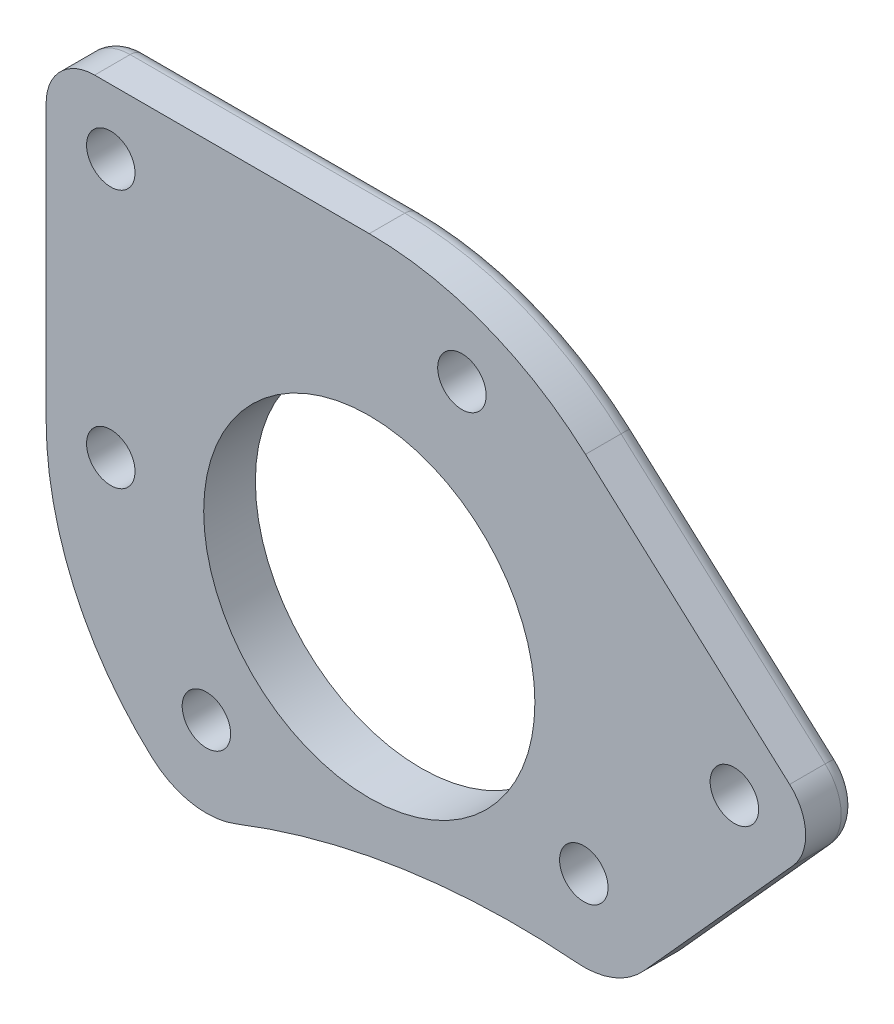
ISO-10303-21;
HEADER;
FILE_DESCRIPTION(('STEP AP214'),'2;1');
FILE_NAME('part.step','',(''),(''),'','','');
FILE_SCHEMA(('AUTOMOTIVE_DESIGN { 1 0 10303 214 1 1 1 1 }'));
ENDSEC;
DATA;
#1=APPLICATION_CONTEXT('core data for automotive mechanical design processes');
#2=APPLICATION_PROTOCOL_DEFINITION('international standard','automotive_design',2000,#1);
#3=PRODUCT_CONTEXT('',#1,'mechanical');
#4=PRODUCT('Part','Part','',(#3));
#5=PRODUCT_RELATED_PRODUCT_CATEGORY('part','',(#4));
#6=PRODUCT_DEFINITION_FORMATION('','',#4);
#7=PRODUCT_DEFINITION_CONTEXT('part definition',#1,'design');
#8=PRODUCT_DEFINITION('design','',#6,#7);
#9=PRODUCT_DEFINITION_SHAPE('','',#8);
#10=(LENGTH_UNIT() NAMED_UNIT(*) SI_UNIT(.MILLI.,.METRE.));
#11=(NAMED_UNIT(*) PLANE_ANGLE_UNIT() SI_UNIT($,.RADIAN.));
#12=(NAMED_UNIT(*) SI_UNIT($,.STERADIAN.) SOLID_ANGLE_UNIT());
#13=UNCERTAINTY_MEASURE_WITH_UNIT(LENGTH_MEASURE(1.E-05),#10,'distance_accuracy_value','');
#14=(GEOMETRIC_REPRESENTATION_CONTEXT(3) GLOBAL_UNCERTAINTY_ASSIGNED_CONTEXT((#13)) GLOBAL_UNIT_ASSIGNED_CONTEXT((#10,
#11,#12)) REPRESENTATION_CONTEXT('',''));
#15=CARTESIAN_POINT('',(0.,0.,0.));
#16=DIRECTION('',(0.,0.,1.));
#17=DIRECTION('',(1.,0.,0.));
#18=AXIS2_PLACEMENT_3D('',#15,#16,#17);
#19=CARTESIAN_POINT('',(-9.04859708366365,60.,3.2));
#20=DIRECTION('',(0.,0.,1.));
#21=DIRECTION('',(1.,0.,0.));
#22=AXIS2_PLACEMENT_3D('',#19,#20,#21);
#23=PLANE('',#22);
#24=CARTESIAN_POINT('',(4.22923295469568,52.3293759624067,3.2));
#25=DIRECTION('',(0.,0.,1.));
#26=DIRECTION('',(1.,0.,0.));
#27=AXIS2_PLACEMENT_3D('',#24,#25,#26);
#28=CIRCLE('',#27,1.50000000000087);
#29=CARTESIAN_POINT('',(5.72923295469655,52.3293759624067,3.2));
#30=VERTEX_POINT('',#29);
#31=EDGE_CURVE('E263',#30,#30,#28,.T.);
#32=ORIENTED_EDGE('',*,*,#31,.F.);
#33=EDGE_LOOP('',(#32));
#34=FACE_BOUND('',#33,.T.);
#35=CARTESIAN_POINT('',(-25.0485970836627,60.0000000000001,3.2));
#36=DIRECTION('',(0.,0.,1.));
#37=DIRECTION('',(1.,0.,0.));
#38=AXIS2_PLACEMENT_3D('',#35,#36,#37);
#39=CIRCLE('',#38,1.50000000000086);
#40=CARTESIAN_POINT('',(-23.5485970836619,60.0000000000001,3.2));
#41=VERTEX_POINT('',#40);
#42=EDGE_CURVE('E275',#41,#41,#39,.T.);
#43=ORIENTED_EDGE('',*,*,#42,.F.);
#44=EDGE_LOOP('',(#43));
#45=FACE_BOUND('',#44,.T.);
#46=CARTESIAN_POINT('',(-25.0485970836626,76.,3.2));
#47=DIRECTION('',(0.,0.,1.));
#48=DIRECTION('',(1.,0.,0.));
#49=AXIS2_PLACEMENT_3D('',#46,#47,#48);
#50=CIRCLE('',#49,1.50000000000096);
#51=CARTESIAN_POINT('',(-23.5485970836616,76.,3.2));
#52=VERTEX_POINT('',#51);
#53=EDGE_CURVE('E287',#52,#52,#50,.T.);
#54=ORIENTED_EDGE('',*,*,#53,.F.);
#55=EDGE_LOOP('',(#54));
#56=FACE_BOUND('',#55,.T.);
#57=CARTESIAN_POINT('',(-9.04859708366365,60.,3.2));
#58=DIRECTION('',(0.,0.,1.));
#59=DIRECTION('',(1.,0.,0.));
#60=AXIS2_PLACEMENT_3D('',#57,#58,#59);
#61=CIRCLE('',#60,20.0000000000015);
#62=CARTESIAN_POINT('',(4.33401504351408,74.8628965095494,3.2));
#63=VERTEX_POINT('',#62);
#64=CARTESIAN_POINT('',(-9.04859708366318,80.0000000000015,3.2));
#65=VERTEX_POINT('',#64);
#66=EDGE_CURVE('E161',#63,#65,#61,.T.);
#67=ORIENTED_EDGE('',*,*,#66,.T.);
#68=DIRECTION('',(-1.,0.,0.));
#69=VECTOR('',#68,1.);
#70=CARTESIAN_POINT('',(-26.0485970836631,80.0000000000015,3.2));
#71=LINE('',#70,#69);
#72=CARTESIAN_POINT('',(-26.0485970836631,80.0000000000015,3.2));
#73=VERTEX_POINT('',#72);
#74=EDGE_CURVE('E151',#65,#73,#71,.T.);
#75=ORIENTED_EDGE('',*,*,#74,.T.);
#76=CARTESIAN_POINT('',(-26.0485970836632,77.0000000000015,3.2));
#77=DIRECTION('',(0.,0.,1.));
#78=DIRECTION('',(1.,0.,0.));
#79=AXIS2_PLACEMENT_3D('',#76,#77,#78);
#80=CIRCLE('',#79,3.);
#81=CARTESIAN_POINT('',(-29.0485970836632,77.0000000000015,3.2));
#82=VERTEX_POINT('',#81);
#83=EDGE_CURVE('E160',#73,#82,#80,.T.);
#84=ORIENTED_EDGE('',*,*,#83,.T.);
#85=DIRECTION('',(0.,-1.,0.));
#86=VECTOR('',#85,1.);
#87=CARTESIAN_POINT('',(-29.0485970836632,60.0000000000015,3.2));
#88=LINE('',#87,#86);
#89=CARTESIAN_POINT('',(-29.0485970836632,60.0000000000015,3.2));
#90=VERTEX_POINT('',#89);
#91=EDGE_CURVE('E298',#82,#90,#88,.T.);
#92=ORIENTED_EDGE('',*,*,#91,.T.);
#93=CARTESIAN_POINT('',(-9.04859708366318,60.0000000000015,3.2));
#94=DIRECTION('',(0.,0.,1.));
#95=DIRECTION('',(1.,0.,0.));
#96=AXIS2_PLACEMENT_3D('',#93,#94,#95);
#97=CIRCLE('',#96,20.);
#98=CARTESIAN_POINT('',(-22.4880220711237,45.1884553132911,3.2));
#99=VERTEX_POINT('',#98);
#100=EDGE_CURVE('E300',#90,#99,#97,.T.);
#101=ORIENTED_EDGE('',*,*,#100,.T.);
#102=CARTESIAN_POINT('',(-19.1281658242585,48.8913414849687,3.2));
#103=DIRECTION('',(0.,0.,1.));
#104=DIRECTION('',(1.,0.,0.));
#105=AXIS2_PLACEMENT_3D('',#102,#103,#104);
#106=CIRCLE('',#105,4.99999999999999);
#107=CARTESIAN_POINT('',(-17.3064357457577,44.2350232483052,3.2));
#108=VERTEX_POINT('',#107);
#109=EDGE_CURVE('E302',#99,#108,#106,.T.);
#110=ORIENTED_EDGE('',*,*,#109,.T.);
#111=CARTESIAN_POINT('',(1.11022302462516E-13,1.60982338570648E-12,3.2));
#112=DIRECTION('',(0.,0.,-1.));
#113=DIRECTION('',(1.,0.,0.));
#114=AXIS2_PLACEMENT_3D('',#111,#112,#113);
#115=CIRCLE('',#114,47.5);
#116=CARTESIAN_POINT('',(3.82644886377195,47.3456258707506,3.2));
#117=VERTEX_POINT('',#116);
#118=EDGE_CURVE('E304',#108,#117,#115,.T.);
#119=ORIENTED_EDGE('',*,*,#118,.T.);
#120=CARTESIAN_POINT('',(4.22923295469529,52.3293759624084,3.2));
#121=DIRECTION('',(0.,0.,1.));
#122=DIRECTION('',(1.,0.,0.));
#123=AXIS2_PLACEMENT_3D('',#120,#121,#122);
#124=CIRCLE('',#123,5.00000000000005);
#125=CARTESIAN_POINT('',(7.94495708208234,48.9837229306141,3.2));
#126=VERTEX_POINT('',#125);
#127=EDGE_CURVE('E306',#117,#126,#124,.T.);
#128=ORIENTED_EDGE('',*,*,#127,.T.);
#129=DIRECTION('',(0.669130606358855,0.743144825477397,0.));
#130=VECTOR('',#129,1.);
#131=CARTESIAN_POINT('',(17.1895197339854,59.2508499059402,3.2));
#132=LINE('',#131,#130);
#133=CARTESIAN_POINT('',(17.1895197339854,59.2508499059402,3.2));
#134=VERTEX_POINT('',#133);
#135=EDGE_CURVE('E308',#126,#134,#132,.T.);
#136=ORIENTED_EDGE('',*,*,#135,.T.);
#137=CARTESIAN_POINT('',(14.9600852575532,61.2582417250168,3.2));
#138=DIRECTION('',(0.,0.,1.));
#139=DIRECTION('',(1.,0.,0.));
#140=AXIS2_PLACEMENT_3D('',#137,#138,#139);
#141=CIRCLE('',#140,3.00000000000001);
#142=CARTESIAN_POINT('',(16.9674770766297,63.487676201449,3.2));
#143=VERTEX_POINT('',#142);
#144=EDGE_CURVE('E310',#134,#143,#141,.T.);
#145=ORIENTED_EDGE('',*,*,#144,.T.);
#146=DIRECTION('',(-0.743144825477398,0.669130606358854,0.));
#147=VECTOR('',#146,1.);
#148=CARTESIAN_POINT('',(4.33401504351408,74.8628965095494,3.2));
#149=LINE('',#148,#147);
#150=EDGE_CURVE('E166',#143,#63,#149,.T.);
#151=ORIENTED_EDGE('',*,*,#150,.T.);
#152=EDGE_LOOP('',(#67,#75,#84,#92,#101,#110,#119,#128,#136,#145,#151));
#153=FACE_BOUND('',#152,.T.);
#154=CARTESIAN_POINT('',(-9.04859708366351,60.,3.2));
#155=DIRECTION('',(0.,0.,1.));
#156=DIRECTION('',(1.,0.,0.));
#157=AXIS2_PLACEMENT_3D('',#154,#155,#156);
#158=CIRCLE('',#157,10.25);
#159=CARTESIAN_POINT('',(1.20140291633648,60.,3.2));
#160=VERTEX_POINT('',#159);
#161=EDGE_CURVE('E167',#160,#160,#158,.T.);
#162=ORIENTED_EDGE('',*,*,#161,.F.);
#163=EDGE_LOOP('',(#162));
#164=FACE_BOUND('',#163,.T.);
#165=CARTESIAN_POINT('',(-3.31470989093779,74.937286823955,3.2));
#166=DIRECTION('',(0.,0.,1.));
#167=DIRECTION('',(1.,0.,0.));
#168=AXIS2_PLACEMENT_3D('',#165,#166,#167);
#169=CIRCLE('',#168,1.50000000000101);
#170=CARTESIAN_POINT('',(-1.81470989093678,74.937286823955,3.2));
#171=VERTEX_POINT('',#170);
#172=EDGE_CURVE('E281',#171,#171,#169,.T.);
#173=ORIENTED_EDGE('',*,*,#172,.F.);
#174=EDGE_LOOP('',(#173));
#175=FACE_BOUND('',#174,.T.);
#176=CARTESIAN_POINT('',(-19.1281658242582,48.8913414849672,3.2));
#177=DIRECTION('',(0.,0.,1.));
#178=DIRECTION('',(1.,0.,0.));
#179=AXIS2_PLACEMENT_3D('',#176,#177,#178);
#180=CIRCLE('',#179,1.50000000000079);
#181=CARTESIAN_POINT('',(-17.6281658242574,48.8913414849672,3.2));
#182=VERTEX_POINT('',#181);
#183=EDGE_CURVE('E269',#182,#182,#180,.T.);
#184=ORIENTED_EDGE('',*,*,#183,.F.);
#185=EDGE_LOOP('',(#184));
#186=FACE_BOUND('',#185,.T.);
#187=CARTESIAN_POINT('',(13.5478098257173,61.1842275058965,3.2));
#188=DIRECTION('',(0.,0.,1.));
#189=DIRECTION('',(1.,0.,0.));
#190=AXIS2_PLACEMENT_3D('',#187,#188,#189);
#191=CIRCLE('',#190,1.500000000001);
#192=CARTESIAN_POINT('',(15.0478098257183,61.1842275058965,3.2));
#193=VERTEX_POINT('',#192);
#194=EDGE_CURVE('E255',#193,#193,#191,.T.);
#195=ORIENTED_EDGE('',*,*,#194,.F.);
#196=EDGE_LOOP('',(#195));
#197=FACE_BOUND('',#196,.T.);
#198=ADVANCED_FACE('F34',(#34,#45,#56,#153,#164,#175,#186,#197),#23,.T.);
#199=CARTESIAN_POINT('',(-9.04859708366365,60.,0.));
#200=DIRECTION('',(0.,0.,1.));
#201=DIRECTION('',(1.,0.,0.));
#202=AXIS2_PLACEMENT_3D('',#199,#200,#201);
#203=PLANE('',#202);
#204=DIRECTION('',(-0.743144825477398,0.669130606358854,0.));
#205=VECTOR('',#204,1.);
#206=CARTESIAN_POINT('',(3.66488443715557,74.1197516840717,0.));
#207=LINE('',#206,#205);
#208=CARTESIAN_POINT('',(3.66488443715524,74.119751684072,0.));
#209=VERTEX_POINT('',#208);
#210=CARTESIAN_POINT('',(16.2983464702709,62.7445313759716,0.));
#211=VERTEX_POINT('',#210);
#212=EDGE_CURVE('E173',#209,#211,#207,.F.);
#213=ORIENTED_EDGE('',*,*,#212,.T.);
#214=CARTESIAN_POINT('',(14.9600852575532,61.2582417250168,0.));
#215=DIRECTION('',(0.,0.,1.));
#216=DIRECTION('',(1.,0.,0.));
#217=AXIS2_PLACEMENT_3D('',#214,#215,#216);
#218=CIRCLE('',#217,2.00000000000001);
#219=CARTESIAN_POINT('',(16.446374908508,59.9199805122991,0.));
#220=VERTEX_POINT('',#219);
#221=EDGE_CURVE('E198',#211,#220,#218,.F.);
#222=ORIENTED_EDGE('',*,*,#221,.T.);
#223=DIRECTION('',(0.669130606358855,0.743144825477397,0.));
#224=VECTOR('',#223,1.);
#225=CARTESIAN_POINT('',(5.07115460040641,47.2865184791822,0.));
#226=LINE('',#225,#224);
#227=CARTESIAN_POINT('',(7.20181225660493,49.652853536973,0.));
#228=VERTEX_POINT('',#227);
#229=EDGE_CURVE('E196',#220,#228,#226,.F.);
#230=ORIENTED_EDGE('',*,*,#229,.T.);
#231=CARTESIAN_POINT('',(4.22923295469529,52.3293759624084,0.));
#232=DIRECTION('',(0.,0.,1.));
#233=DIRECTION('',(1.,0.,0.));
#234=AXIS2_PLACEMENT_3D('',#231,#232,#233);
#235=CIRCLE('',#234,4.00000000000005);
#236=CARTESIAN_POINT('',(3.90700568195662,48.3423758890822,0.));
#237=VERTEX_POINT('',#236);
#238=EDGE_CURVE('E194',#228,#237,#235,.F.);
#239=ORIENTED_EDGE('',*,*,#238,.T.);
#240=CARTESIAN_POINT('',(1.11022302462516E-13,1.60982338570648E-12,0.));
#241=DIRECTION('',(0.,0.,1.));
#242=DIRECTION('',(1.,0.,0.));
#243=AXIS2_PLACEMENT_3D('',#240,#241,#242);
#244=CIRCLE('',#243,48.5);
#245=CARTESIAN_POINT('',(-17.6707817614579,45.1662868956379,0.));
#246=VERTEX_POINT('',#245);
#247=EDGE_CURVE('E192',#237,#246,#244,.T.);
#248=ORIENTED_EDGE('',*,*,#247,.T.);
#249=CARTESIAN_POINT('',(-19.1281658242585,48.8913414849687,0.));
#250=DIRECTION('',(0.,0.,1.));
#251=DIRECTION('',(1.,0.,0.));
#252=AXIS2_PLACEMENT_3D('',#249,#250,#251);
#253=CIRCLE('',#252,3.99999999999999);
#254=CARTESIAN_POINT('',(-21.8160508217506,45.9290325476266,0.));
#255=VERTEX_POINT('',#254);
#256=EDGE_CURVE('E190',#246,#255,#253,.F.);
#257=ORIENTED_EDGE('',*,*,#256,.T.);
#258=CARTESIAN_POINT('',(-9.04859708366318,60.0000000000015,0.));
#259=DIRECTION('',(0.,0.,1.));
#260=DIRECTION('',(1.,0.,0.));
#261=AXIS2_PLACEMENT_3D('',#258,#259,#260);
#262=CIRCLE('',#261,19.);
#263=CARTESIAN_POINT('',(-28.0485970836632,60.0000000000015,0.));
#264=VERTEX_POINT('',#263);
#265=EDGE_CURVE('E188',#255,#264,#262,.F.);
#266=ORIENTED_EDGE('',*,*,#265,.T.);
#267=DIRECTION('',(0.,-1.,0.));
#268=VECTOR('',#267,1.);
#269=CARTESIAN_POINT('',(-28.0485970836632,60.,0.));
#270=LINE('',#269,#268);
#271=CARTESIAN_POINT('',(-28.0485970836632,77.0000000000015,0.));
#272=VERTEX_POINT('',#271);
#273=EDGE_CURVE('E186',#264,#272,#270,.F.);
#274=ORIENTED_EDGE('',*,*,#273,.T.);
#275=CARTESIAN_POINT('',(-26.0485970836632,77.0000000000015,0.));
#276=DIRECTION('',(0.,0.,1.));
#277=DIRECTION('',(1.,0.,0.));
#278=AXIS2_PLACEMENT_3D('',#275,#276,#277);
#279=CIRCLE('',#278,2.);
#280=CARTESIAN_POINT('',(-26.0485970836632,79.0000000000015,0.));
#281=VERTEX_POINT('',#280);
#282=EDGE_CURVE('E184',#272,#281,#279,.F.);
#283=ORIENTED_EDGE('',*,*,#282,.T.);
#284=DIRECTION('',(-1.,0.,0.));
#285=VECTOR('',#284,1.);
#286=CARTESIAN_POINT('',(-9.04859708366362,79.0000000000015,0.));
#287=LINE('',#286,#285);
#288=CARTESIAN_POINT('',(-9.04859708366318,79.0000000000015,0.));
#289=VERTEX_POINT('',#288);
#290=EDGE_CURVE('E182',#281,#289,#287,.F.);
#291=ORIENTED_EDGE('',*,*,#290,.T.);
#292=CARTESIAN_POINT('',(-9.04859708366365,60.,0.));
#293=DIRECTION('',(0.,0.,1.));
#294=DIRECTION('',(1.,0.,0.));
#295=AXIS2_PLACEMENT_3D('',#292,#293,#294);
#296=CIRCLE('',#295,19.0000000000015);
#297=EDGE_CURVE('E180',#289,#209,#296,.F.);
#298=ORIENTED_EDGE('',*,*,#297,.T.);
#299=EDGE_LOOP('',(#213,#222,#230,#239,#248,#257,#266,#274,#283,#291,#298));
#300=FACE_BOUND('',#299,.T.);
#301=CARTESIAN_POINT('',(-9.04859708366351,60.,0.));
#302=DIRECTION('',(0.,0.,1.));
#303=DIRECTION('',(1.,0.,0.));
#304=AXIS2_PLACEMENT_3D('',#301,#302,#303);
#305=CIRCLE('',#304,10.25);
#306=CARTESIAN_POINT('',(1.20140291633648,60.,0.));
#307=VERTEX_POINT('',#306);
#308=EDGE_CURVE('E290',#307,#307,#305,.T.);
#309=ORIENTED_EDGE('',*,*,#308,.T.);
#310=EDGE_LOOP('',(#309));
#311=FACE_BOUND('',#310,.T.);
#312=CARTESIAN_POINT('',(-25.0485970836626,76.,0.));
#313=DIRECTION('',(0.,0.,1.));
#314=DIRECTION('',(1.,0.,0.));
#315=AXIS2_PLACEMENT_3D('',#312,#313,#314);
#316=CIRCLE('',#315,1.50000000000096);
#317=CARTESIAN_POINT('',(-23.5485970836616,76.,0.));
#318=VERTEX_POINT('',#317);
#319=EDGE_CURVE('E284',#318,#318,#316,.T.);
#320=ORIENTED_EDGE('',*,*,#319,.T.);
#321=EDGE_LOOP('',(#320));
#322=FACE_BOUND('',#321,.T.);
#323=CARTESIAN_POINT('',(-3.31470989093779,74.937286823955,0.));
#324=DIRECTION('',(0.,0.,1.));
#325=DIRECTION('',(1.,0.,0.));
#326=AXIS2_PLACEMENT_3D('',#323,#324,#325);
#327=CIRCLE('',#326,1.50000000000101);
#328=CARTESIAN_POINT('',(-1.81470989093678,74.937286823955,0.));
#329=VERTEX_POINT('',#328);
#330=EDGE_CURVE('E278',#329,#329,#327,.T.);
#331=ORIENTED_EDGE('',*,*,#330,.T.);
#332=EDGE_LOOP('',(#331));
#333=FACE_BOUND('',#332,.T.);
#334=CARTESIAN_POINT('',(-25.0485970836627,60.0000000000001,0.));
#335=DIRECTION('',(0.,0.,1.));
#336=DIRECTION('',(1.,0.,0.));
#337=AXIS2_PLACEMENT_3D('',#334,#335,#336);
#338=CIRCLE('',#337,1.50000000000086);
#339=CARTESIAN_POINT('',(-23.5485970836619,60.0000000000001,0.));
#340=VERTEX_POINT('',#339);
#341=EDGE_CURVE('E272',#340,#340,#338,.T.);
#342=ORIENTED_EDGE('',*,*,#341,.T.);
#343=EDGE_LOOP('',(#342));
#344=FACE_BOUND('',#343,.T.);
#345=CARTESIAN_POINT('',(-19.1281658242582,48.8913414849672,0.));
#346=DIRECTION('',(0.,0.,1.));
#347=DIRECTION('',(1.,0.,0.));
#348=AXIS2_PLACEMENT_3D('',#345,#346,#347);
#349=CIRCLE('',#348,1.50000000000079);
#350=CARTESIAN_POINT('',(-17.6281658242574,48.8913414849672,0.));
#351=VERTEX_POINT('',#350);
#352=EDGE_CURVE('E266',#351,#351,#349,.T.);
#353=ORIENTED_EDGE('',*,*,#352,.T.);
#354=EDGE_LOOP('',(#353));
#355=FACE_BOUND('',#354,.T.);
#356=CARTESIAN_POINT('',(4.22923295469568,52.3293759624067,0.));
#357=DIRECTION('',(0.,0.,1.));
#358=DIRECTION('',(1.,0.,0.));
#359=AXIS2_PLACEMENT_3D('',#356,#357,#358);
#360=CIRCLE('',#359,1.50000000000087);
#361=CARTESIAN_POINT('',(5.72923295469655,52.3293759624067,0.));
#362=VERTEX_POINT('',#361);
#363=EDGE_CURVE('E260',#362,#362,#360,.T.);
#364=ORIENTED_EDGE('',*,*,#363,.T.);
#365=EDGE_LOOP('',(#364));
#366=FACE_BOUND('',#365,.T.);
#367=CARTESIAN_POINT('',(13.5478098257173,61.1842275058965,0.));
#368=DIRECTION('',(0.,0.,1.));
#369=DIRECTION('',(1.,0.,0.));
#370=AXIS2_PLACEMENT_3D('',#367,#368,#369);
#371=CIRCLE('',#370,1.500000000001);
#372=CARTESIAN_POINT('',(15.0478098257183,61.1842275058965,0.));
#373=VERTEX_POINT('',#372);
#374=EDGE_CURVE('E249',#373,#373,#371,.T.);
#375=ORIENTED_EDGE('',*,*,#374,.T.);
#376=EDGE_LOOP('',(#375));
#377=FACE_BOUND('',#376,.T.);
#378=ADVANCED_FACE('F350',(#300,#311,#322,#333,#344,#355,#366,#377),#203,.F.);
#379=CARTESIAN_POINT('',(-9.04859708366365,60.,3.2));
#380=DIRECTION('',(0.,0.,-1.));
#381=DIRECTION('',(-1.,0.,0.));
#382=AXIS2_PLACEMENT_3D('',#379,#380,#381);
#383=CYLINDRICAL_SURFACE('',#382,20.0000000000015);
#384=DIRECTION('',(0.,0.,-1.));
#385=VECTOR('',#384,1.);
#386=CARTESIAN_POINT('',(4.33401504351408,74.8628965095494,3.2));
#387=LINE('',#386,#385);
#388=CARTESIAN_POINT('',(4.33401504351408,74.8628965095494,1.));
#389=VERTEX_POINT('',#388);
#390=EDGE_CURVE('E313',#63,#389,#387,.T.);
#391=ORIENTED_EDGE('',*,*,#390,.T.);
#392=CARTESIAN_POINT('',(-9.04859708366365,60.,1.));
#393=DIRECTION('',(0.,0.,1.));
#394=DIRECTION('',(1.,0.,0.));
#395=AXIS2_PLACEMENT_3D('',#392,#393,#394);
#396=CIRCLE('',#395,20.0000000000015);
#397=CARTESIAN_POINT('',(-9.04859708366318,80.0000000000015,1.));
#398=VERTEX_POINT('',#397);
#399=EDGE_CURVE('E43',#389,#398,#396,.T.);
#400=ORIENTED_EDGE('',*,*,#399,.T.);
#401=DIRECTION('',(0.,0.,-1.));
#402=VECTOR('',#401,1.);
#403=CARTESIAN_POINT('',(-9.04859708366318,80.0000000000015,3.2));
#404=LINE('',#403,#402);
#405=EDGE_CURVE('E154',#65,#398,#404,.T.);
#406=ORIENTED_EDGE('',*,*,#405,.F.);
#407=ORIENTED_EDGE('',*,*,#66,.F.);
#408=EDGE_LOOP('',(#391,#400,#406,#407));
#409=FACE_BOUND('',#408,.T.);
#410=ADVANCED_FACE('F169',(#409),#383,.T.);
#411=CARTESIAN_POINT('',(-26.0485970836631,80.0000000000015,3.2));
#412=DIRECTION('',(0.,-1.,0.));
#413=DIRECTION('',(1.,0.,0.));
#414=AXIS2_PLACEMENT_3D('',#411,#412,#413);
#415=PLANE('',#414);
#416=ORIENTED_EDGE('',*,*,#405,.T.);
#417=DIRECTION('',(-1.,0.,0.));
#418=VECTOR('',#417,1.);
#419=CARTESIAN_POINT('',(-26.0485970836631,80.0000000000015,1.));
#420=LINE('',#419,#418);
#421=CARTESIAN_POINT('',(-26.0485970836631,80.0000000000015,1.));
#422=VERTEX_POINT('',#421);
#423=EDGE_CURVE('E215',#398,#422,#420,.T.);
#424=ORIENTED_EDGE('',*,*,#423,.T.);
#425=DIRECTION('',(0.,0.,-1.));
#426=VECTOR('',#425,1.);
#427=CARTESIAN_POINT('',(-26.0485970836631,80.0000000000015,3.2));
#428=LINE('',#427,#426);
#429=EDGE_CURVE('E157',#73,#422,#428,.T.);
#430=ORIENTED_EDGE('',*,*,#429,.F.);
#431=ORIENTED_EDGE('',*,*,#74,.F.);
#432=EDGE_LOOP('',(#416,#424,#430,#431));
#433=FACE_BOUND('',#432,.T.);
#434=ADVANCED_FACE('F153',(#433),#415,.F.);
#435=CARTESIAN_POINT('',(-26.0485970836632,77.0000000000015,3.2));
#436=DIRECTION('',(0.,0.,-1.));
#437=DIRECTION('',(-1.,0.,0.));
#438=AXIS2_PLACEMENT_3D('',#435,#436,#437);
#439=CYLINDRICAL_SURFACE('',#438,3.);
#440=ORIENTED_EDGE('',*,*,#429,.T.);
#441=CARTESIAN_POINT('',(-26.0485970836632,77.0000000000015,1.));
#442=DIRECTION('',(0.,0.,1.));
#443=DIRECTION('',(1.,0.,0.));
#444=AXIS2_PLACEMENT_3D('',#441,#442,#443);
#445=CIRCLE('',#444,3.);
#446=CARTESIAN_POINT('',(-29.0485970836632,77.0000000000015,1.));
#447=VERTEX_POINT('',#446);
#448=EDGE_CURVE('E213',#422,#447,#445,.T.);
#449=ORIENTED_EDGE('',*,*,#448,.T.);
#450=DIRECTION('',(0.,0.,-1.));
#451=VECTOR('',#450,1.);
#452=CARTESIAN_POINT('',(-29.0485970836632,77.0000000000015,3.2));
#453=LINE('',#452,#451);
#454=EDGE_CURVE('E175',#82,#447,#453,.T.);
#455=ORIENTED_EDGE('',*,*,#454,.F.);
#456=ORIENTED_EDGE('',*,*,#83,.F.);
#457=EDGE_LOOP('',(#440,#449,#455,#456));
#458=FACE_BOUND('',#457,.T.);
#459=ADVANCED_FACE('F366',(#458),#439,.T.);
#460=CARTESIAN_POINT('',(-29.0485970836632,60.0000000000015,3.2));
#461=DIRECTION('',(1.,0.,0.));
#462=DIRECTION('',(0.,0.,-1.));
#463=AXIS2_PLACEMENT_3D('',#460,#461,#462);
#464=PLANE('',#463);
#465=ORIENTED_EDGE('',*,*,#454,.T.);
#466=DIRECTION('',(0.,-1.,0.));
#467=VECTOR('',#466,1.);
#468=CARTESIAN_POINT('',(-29.0485970836632,60.0000000000015,1.));
#469=LINE('',#468,#467);
#470=CARTESIAN_POINT('',(-29.0485970836632,60.0000000000015,1.));
#471=VERTEX_POINT('',#470);
#472=EDGE_CURVE('E211',#447,#471,#469,.T.);
#473=ORIENTED_EDGE('',*,*,#472,.T.);
#474=DIRECTION('',(0.,0.,-1.));
#475=VECTOR('',#474,1.);
#476=CARTESIAN_POINT('',(-29.0485970836632,60.0000000000015,3.2));
#477=LINE('',#476,#475);
#478=EDGE_CURVE('E332',#90,#471,#477,.T.);
#479=ORIENTED_EDGE('',*,*,#478,.F.);
#480=ORIENTED_EDGE('',*,*,#91,.F.);
#481=EDGE_LOOP('',(#465,#473,#479,#480));
#482=FACE_BOUND('',#481,.T.);
#483=ADVANCED_FACE('F338',(#482),#464,.F.);
#484=CARTESIAN_POINT('',(-9.04859708366318,60.0000000000015,3.2));
#485=DIRECTION('',(0.,0.,-1.));
#486=DIRECTION('',(-1.,0.,0.));
#487=AXIS2_PLACEMENT_3D('',#484,#485,#486);
#488=CYLINDRICAL_SURFACE('',#487,20.);
#489=ORIENTED_EDGE('',*,*,#478,.T.);
#490=CARTESIAN_POINT('',(-9.04859708366318,60.0000000000015,1.));
#491=DIRECTION('',(0.,0.,1.));
#492=DIRECTION('',(1.,0.,0.));
#493=AXIS2_PLACEMENT_3D('',#490,#491,#492);
#494=CIRCLE('',#493,20.);
#495=CARTESIAN_POINT('',(-22.4880220711237,45.1884553132911,1.));
#496=VERTEX_POINT('',#495);
#497=EDGE_CURVE('E209',#471,#496,#494,.T.);
#498=ORIENTED_EDGE('',*,*,#497,.T.);
#499=DIRECTION('',(0.,0.,-1.));
#500=VECTOR('',#499,1.);
#501=CARTESIAN_POINT('',(-22.4880220711237,45.1884553132911,3.2));
#502=LINE('',#501,#500);
#503=EDGE_CURVE('E329',#99,#496,#502,.T.);
#504=ORIENTED_EDGE('',*,*,#503,.F.);
#505=ORIENTED_EDGE('',*,*,#100,.F.);
#506=EDGE_LOOP('',(#489,#498,#504,#505));
#507=FACE_BOUND('',#506,.T.);
#508=ADVANCED_FACE('F358',(#507),#488,.T.);
#509=CARTESIAN_POINT('',(-19.1281658242585,48.8913414849687,3.2));
#510=DIRECTION('',(0.,0.,-1.));
#511=DIRECTION('',(-1.,0.,0.));
#512=AXIS2_PLACEMENT_3D('',#509,#510,#511);
#513=CYLINDRICAL_SURFACE('',#512,4.99999999999999);
#514=ORIENTED_EDGE('',*,*,#503,.T.);
#515=CARTESIAN_POINT('',(-19.1281658242585,48.8913414849687,1.));
#516=DIRECTION('',(0.,0.,1.));
#517=DIRECTION('',(1.,0.,0.));
#518=AXIS2_PLACEMENT_3D('',#515,#516,#517);
#519=CIRCLE('',#518,4.99999999999999);
#520=CARTESIAN_POINT('',(-17.3064357457577,44.2350232483052,1.));
#521=VERTEX_POINT('',#520);
#522=EDGE_CURVE('E207',#496,#521,#519,.T.);
#523=ORIENTED_EDGE('',*,*,#522,.T.);
#524=DIRECTION('',(0.,0.,-1.));
#525=VECTOR('',#524,1.);
#526=CARTESIAN_POINT('',(-17.3064357457577,44.2350232483052,3.2));
#527=LINE('',#526,#525);
#528=EDGE_CURVE('E326',#108,#521,#527,.T.);
#529=ORIENTED_EDGE('',*,*,#528,.F.);
#530=ORIENTED_EDGE('',*,*,#109,.F.);
#531=EDGE_LOOP('',(#514,#523,#529,#530));
#532=FACE_BOUND('',#531,.T.);
#533=ADVANCED_FACE('F362',(#532),#513,.T.);
#534=CARTESIAN_POINT('',(1.11022302462516E-13,1.60982338570648E-12,3.2));
#535=DIRECTION('',(0.,0.,-1.));
#536=DIRECTION('',(-1.,0.,0.));
#537=AXIS2_PLACEMENT_3D('',#534,#535,#536);
#538=CYLINDRICAL_SURFACE('',#537,47.5);
#539=ORIENTED_EDGE('',*,*,#528,.T.);
#540=CARTESIAN_POINT('',(1.11022302462516E-13,1.60982338570648E-12,1.));
#541=DIRECTION('',(0.,0.,1.));
#542=DIRECTION('',(1.,0.,0.));
#543=AXIS2_PLACEMENT_3D('',#540,#541,#542);
#544=CIRCLE('',#543,47.5);
#545=CARTESIAN_POINT('',(3.82644886377195,47.3456258707506,1.));
#546=VERTEX_POINT('',#545);
#547=EDGE_CURVE('E205',#521,#546,#544,.F.);
#548=ORIENTED_EDGE('',*,*,#547,.T.);
#549=DIRECTION('',(0.,0.,-1.));
#550=VECTOR('',#549,1.);
#551=CARTESIAN_POINT('',(3.82644886377195,47.3456258707506,3.2));
#552=LINE('',#551,#550);
#553=EDGE_CURVE('E323',#117,#546,#552,.T.);
#554=ORIENTED_EDGE('',*,*,#553,.F.);
#555=ORIENTED_EDGE('',*,*,#118,.F.);
#556=EDGE_LOOP('',(#539,#548,#554,#555));
#557=FACE_BOUND('',#556,.T.);
#558=ADVANCED_FACE('F402',(#557),#538,.F.);
#559=CARTESIAN_POINT('',(4.22923295469529,52.3293759624084,3.2));
#560=DIRECTION('',(0.,0.,-1.));
#561=DIRECTION('',(-1.,0.,0.));
#562=AXIS2_PLACEMENT_3D('',#559,#560,#561);
#563=CYLINDRICAL_SURFACE('',#562,5.00000000000005);
#564=ORIENTED_EDGE('',*,*,#553,.T.);
#565=CARTESIAN_POINT('',(4.22923295469529,52.3293759624084,1.));
#566=DIRECTION('',(0.,0.,1.));
#567=DIRECTION('',(1.,0.,0.));
#568=AXIS2_PLACEMENT_3D('',#565,#566,#567);
#569=CIRCLE('',#568,5.00000000000005);
#570=CARTESIAN_POINT('',(7.94495708208234,48.9837229306141,1.));
#571=VERTEX_POINT('',#570);
#572=EDGE_CURVE('E203',#546,#571,#569,.T.);
#573=ORIENTED_EDGE('',*,*,#572,.T.);
#574=DIRECTION('',(0.,0.,-1.));
#575=VECTOR('',#574,1.);
#576=CARTESIAN_POINT('',(7.94495708208234,48.9837229306141,3.2));
#577=LINE('',#576,#575);
#578=EDGE_CURVE('E320',#126,#571,#577,.T.);
#579=ORIENTED_EDGE('',*,*,#578,.F.);
#580=ORIENTED_EDGE('',*,*,#127,.F.);
#581=EDGE_LOOP('',(#564,#573,#579,#580));
#582=FACE_BOUND('',#581,.T.);
#583=ADVANCED_FACE('F398',(#582),#563,.T.);
#584=CARTESIAN_POINT('',(17.1895197339854,59.2508499059402,3.2));
#585=DIRECTION('',(-0.743144825477397,0.669130606358855,0.));
#586=DIRECTION('',(-0.669130606358855,-0.743144825477397,0.));
#587=AXIS2_PLACEMENT_3D('',#584,#585,#586);
#588=PLANE('',#587);
#589=ORIENTED_EDGE('',*,*,#578,.T.);
#590=DIRECTION('',(0.669130606358855,0.743144825477397,0.));
#591=VECTOR('',#590,1.);
#592=CARTESIAN_POINT('',(17.1895197339854,59.2508499059402,1.));
#593=LINE('',#592,#591);
#594=CARTESIAN_POINT('',(17.1895197339854,59.2508499059402,1.));
#595=VERTEX_POINT('',#594);
#596=EDGE_CURVE('E201',#571,#595,#593,.T.);
#597=ORIENTED_EDGE('',*,*,#596,.T.);
#598=DIRECTION('',(0.,0.,-1.));
#599=VECTOR('',#598,1.);
#600=CARTESIAN_POINT('',(17.1895197339854,59.2508499059402,3.2));
#601=LINE('',#600,#599);
#602=EDGE_CURVE('E317',#134,#595,#601,.T.);
#603=ORIENTED_EDGE('',*,*,#602,.F.);
#604=ORIENTED_EDGE('',*,*,#135,.F.);
#605=EDGE_LOOP('',(#589,#597,#603,#604));
#606=FACE_BOUND('',#605,.T.);
#607=ADVANCED_FACE('F394',(#606),#588,.F.);
#608=CARTESIAN_POINT('',(14.9600852575532,61.2582417250168,3.2));
#609=DIRECTION('',(0.,0.,-1.));
#610=DIRECTION('',(-1.,0.,0.));
#611=AXIS2_PLACEMENT_3D('',#608,#609,#610);
#612=CYLINDRICAL_SURFACE('',#611,3.00000000000001);
#613=ORIENTED_EDGE('',*,*,#602,.T.);
#614=CARTESIAN_POINT('',(14.9600852575532,61.2582417250168,1.));
#615=DIRECTION('',(0.,0.,1.));
#616=DIRECTION('',(1.,0.,0.));
#617=AXIS2_PLACEMENT_3D('',#614,#615,#616);
#618=CIRCLE('',#617,3.00000000000001);
#619=CARTESIAN_POINT('',(16.9674770766297,63.487676201449,1.));
#620=VERTEX_POINT('',#619);
#621=EDGE_CURVE('E170',#595,#620,#618,.T.);
#622=ORIENTED_EDGE('',*,*,#621,.T.);
#623=DIRECTION('',(0.,0.,-1.));
#624=VECTOR('',#623,1.);
#625=CARTESIAN_POINT('',(16.9674770766297,63.487676201449,3.2));
#626=LINE('',#625,#624);
#627=EDGE_CURVE('E315',#143,#620,#626,.T.);
#628=ORIENTED_EDGE('',*,*,#627,.F.);
#629=ORIENTED_EDGE('',*,*,#144,.F.);
#630=EDGE_LOOP('',(#613,#622,#628,#629));
#631=FACE_BOUND('',#630,.T.);
#632=ADVANCED_FACE('F391',(#631),#612,.T.);
#633=CARTESIAN_POINT('',(4.33401504351408,74.8628965095494,3.2));
#634=DIRECTION('',(-0.669130606358854,-0.743144825477398,0.));
#635=DIRECTION('',(0.743144825477398,-0.669130606358854,0.));
#636=AXIS2_PLACEMENT_3D('',#633,#634,#635);
#637=PLANE('',#636);
#638=ORIENTED_EDGE('',*,*,#627,.T.);
#639=DIRECTION('',(-0.743144825477398,0.669130606358854,0.));
#640=VECTOR('',#639,1.);
#641=CARTESIAN_POINT('',(4.33401504351408,74.8628965095494,1.));
#642=LINE('',#641,#640);
#643=EDGE_CURVE('E11',#620,#389,#642,.T.);
#644=ORIENTED_EDGE('',*,*,#643,.T.);
#645=ORIENTED_EDGE('',*,*,#390,.F.);
#646=ORIENTED_EDGE('',*,*,#150,.F.);
#647=EDGE_LOOP('',(#638,#644,#645,#646));
#648=FACE_BOUND('',#647,.T.);
#649=ADVANCED_FACE('F388',(#648),#637,.F.);
#650=CARTESIAN_POINT('',(-9.04859708366351,60.,3.2));
#651=DIRECTION('',(0.,0.,-1.));
#652=DIRECTION('',(-1.,0.,0.));
#653=AXIS2_PLACEMENT_3D('',#650,#651,#652);
#654=CYLINDRICAL_SURFACE('',#653,10.25);
#655=ORIENTED_EDGE('',*,*,#161,.T.);
#656=EDGE_LOOP('',(#655));
#657=FACE_BOUND('',#656,.T.);
#658=ORIENTED_EDGE('',*,*,#308,.F.);
#659=EDGE_LOOP('',(#658));
#660=FACE_BOUND('',#659,.T.);
#661=ADVANCED_FACE('F385',(#657,#660),#654,.F.);
#662=CARTESIAN_POINT('',(-25.0485970836626,76.,3.2));
#663=DIRECTION('',(0.,0.,-1.));
#664=DIRECTION('',(-1.,0.,0.));
#665=AXIS2_PLACEMENT_3D('',#662,#663,#664);
#666=CYLINDRICAL_SURFACE('',#665,1.50000000000096);
#667=ORIENTED_EDGE('',*,*,#53,.T.);
#668=EDGE_LOOP('',(#667));
#669=FACE_BOUND('',#668,.T.);
#670=ORIENTED_EDGE('',*,*,#319,.F.);
#671=EDGE_LOOP('',(#670));
#672=FACE_BOUND('',#671,.T.);
#673=ADVANCED_FACE('F445',(#669,#672),#666,.F.);
#674=CARTESIAN_POINT('',(-3.31470989093779,74.937286823955,3.2));
#675=DIRECTION('',(0.,0.,-1.));
#676=DIRECTION('',(-1.,0.,0.));
#677=AXIS2_PLACEMENT_3D('',#674,#675,#676);
#678=CYLINDRICAL_SURFACE('',#677,1.50000000000101);
#679=ORIENTED_EDGE('',*,*,#172,.T.);
#680=EDGE_LOOP('',(#679));
#681=FACE_BOUND('',#680,.T.);
#682=ORIENTED_EDGE('',*,*,#330,.F.);
#683=EDGE_LOOP('',(#682));
#684=FACE_BOUND('',#683,.T.);
#685=ADVANCED_FACE('F452',(#681,#684),#678,.F.);
#686=CARTESIAN_POINT('',(-25.0485970836627,60.0000000000001,3.2));
#687=DIRECTION('',(0.,0.,-1.));
#688=DIRECTION('',(-1.,0.,0.));
#689=AXIS2_PLACEMENT_3D('',#686,#687,#688);
#690=CYLINDRICAL_SURFACE('',#689,1.50000000000086);
#691=ORIENTED_EDGE('',*,*,#42,.T.);
#692=EDGE_LOOP('',(#691));
#693=FACE_BOUND('',#692,.T.);
#694=ORIENTED_EDGE('',*,*,#341,.F.);
#695=EDGE_LOOP('',(#694));
#696=FACE_BOUND('',#695,.T.);
#697=ADVANCED_FACE('F459',(#693,#696),#690,.F.);
#698=CARTESIAN_POINT('',(-19.1281658242582,48.8913414849672,3.2));
#699=DIRECTION('',(0.,0.,-1.));
#700=DIRECTION('',(-1.,0.,0.));
#701=AXIS2_PLACEMENT_3D('',#698,#699,#700);
#702=CYLINDRICAL_SURFACE('',#701,1.50000000000079);
#703=ORIENTED_EDGE('',*,*,#183,.T.);
#704=EDGE_LOOP('',(#703));
#705=FACE_BOUND('',#704,.T.);
#706=ORIENTED_EDGE('',*,*,#352,.F.);
#707=EDGE_LOOP('',(#706));
#708=FACE_BOUND('',#707,.T.);
#709=ADVANCED_FACE('F467',(#705,#708),#702,.F.);
#710=CARTESIAN_POINT('',(4.22923295469568,52.3293759624067,3.2));
#711=DIRECTION('',(0.,0.,-1.));
#712=DIRECTION('',(-1.,0.,0.));
#713=AXIS2_PLACEMENT_3D('',#710,#711,#712);
#714=CYLINDRICAL_SURFACE('',#713,1.50000000000087);
#715=ORIENTED_EDGE('',*,*,#31,.T.);
#716=EDGE_LOOP('',(#715));
#717=FACE_BOUND('',#716,.T.);
#718=ORIENTED_EDGE('',*,*,#363,.F.);
#719=EDGE_LOOP('',(#718));
#720=FACE_BOUND('',#719,.T.);
#721=ADVANCED_FACE('F475',(#717,#720),#714,.F.);
#722=CARTESIAN_POINT('',(13.5478098257173,61.1842275058965,3.2));
#723=DIRECTION('',(0.,0.,-1.));
#724=DIRECTION('',(-1.,0.,0.));
#725=AXIS2_PLACEMENT_3D('',#722,#723,#724);
#726=CYLINDRICAL_SURFACE('',#725,1.500000000001);
#727=ORIENTED_EDGE('',*,*,#194,.T.);
#728=EDGE_LOOP('',(#727));
#729=FACE_BOUND('',#728,.T.);
#730=ORIENTED_EDGE('',*,*,#374,.F.);
#731=EDGE_LOOP('',(#730));
#732=FACE_BOUND('',#731,.T.);
#733=ADVANCED_FACE('F483',(#729,#732),#726,.F.);
#734=CARTESIAN_POINT('',(-9.04859708366318,60.0000000000015,1.));
#735=DIRECTION('',(0.,0.,1.));
#736=DIRECTION('',(1.,0.,0.));
#737=AXIS2_PLACEMENT_3D('',#734,#735,#736);
#738=TOROIDAL_SURFACE('',#737,19.,1.);
#739=CARTESIAN_POINT('',(-21.8160508217506,45.9290325476266,1.));
#740=DIRECTION('',(0.740577234335524,-0.671971249373027,0.));
#741=DIRECTION('',(0.671971249373027,0.740577234335524,0.));
#742=AXIS2_PLACEMENT_3D('',#739,#740,#741);
#743=CIRCLE('',#742,1.);
#744=EDGE_CURVE('E242',#496,#255,#743,.T.);
#745=ORIENTED_EDGE('',*,*,#744,.F.);
#746=ORIENTED_EDGE('',*,*,#497,.F.);
#747=CARTESIAN_POINT('',(-28.0485970836632,60.0000000000015,1.));
#748=DIRECTION('',(0.,1.,0.));
#749=DIRECTION('',(0.,0.,1.));
#750=AXIS2_PLACEMENT_3D('',#747,#748,#749);
#751=CIRCLE('',#750,1.);
#752=EDGE_CURVE('E38',#264,#471,#751,.T.);
#753=ORIENTED_EDGE('',*,*,#752,.F.);
#754=ORIENTED_EDGE('',*,*,#265,.F.);
#755=EDGE_LOOP('',(#745,#746,#753,#754));
#756=FACE_BOUND('',#755,.T.);
#757=ADVANCED_FACE('F36',(#756),#738,.T.);
#758=CARTESIAN_POINT('',(-28.0485970836632,60.0000000000015,1.));
#759=DIRECTION('',(0.,-1.,0.));
#760=DIRECTION('',(0.,0.,-1.));
#761=AXIS2_PLACEMENT_3D('',#758,#759,#760);
#762=CYLINDRICAL_SURFACE('',#761,1.);
#763=ORIENTED_EDGE('',*,*,#752,.T.);
#764=ORIENTED_EDGE('',*,*,#472,.F.);
#765=CARTESIAN_POINT('',(-28.0485970836632,77.0000000000015,1.));
#766=DIRECTION('',(0.,1.,0.));
#767=DIRECTION('',(0.,0.,1.));
#768=AXIS2_PLACEMENT_3D('',#765,#766,#767);
#769=CIRCLE('',#768,1.);
#770=EDGE_CURVE('E240',#272,#447,#769,.T.);
#771=ORIENTED_EDGE('',*,*,#770,.F.);
#772=ORIENTED_EDGE('',*,*,#273,.F.);
#773=EDGE_LOOP('',(#763,#764,#771,#772));
#774=FACE_BOUND('',#773,.T.);
#775=ADVANCED_FACE('F342',(#774),#762,.T.);
#776=CARTESIAN_POINT('',(-19.1281658242585,48.8913414849687,1.));
#777=DIRECTION('',(0.,0.,1.));
#778=DIRECTION('',(1.,0.,0.));
#779=AXIS2_PLACEMENT_3D('',#776,#777,#778);
#780=TOROIDAL_SURFACE('',#779,3.99999999999999,1.);
#781=ORIENTED_EDGE('',*,*,#744,.T.);
#782=ORIENTED_EDGE('',*,*,#256,.F.);
#783=CARTESIAN_POINT('',(-17.6707817614579,45.1662868956379,1.));
#784=DIRECTION('',(0.931263647332707,0.364346015700164,0.));
#785=DIRECTION('',(-0.364346015700164,0.931263647332707,0.));
#786=AXIS2_PLACEMENT_3D('',#783,#784,#785);
#787=CIRCLE('',#786,1.);
#788=EDGE_CURVE('E237',#521,#246,#787,.T.);
#789=ORIENTED_EDGE('',*,*,#788,.F.);
#790=ORIENTED_EDGE('',*,*,#522,.F.);
#791=EDGE_LOOP('',(#781,#782,#789,#790));
#792=FACE_BOUND('',#791,.T.);
#793=ADVANCED_FACE('F503',(#792),#780,.T.);
#794=CARTESIAN_POINT('',(-26.0485970836632,77.0000000000015,1.));
#795=DIRECTION('',(0.,0.,1.));
#796=DIRECTION('',(1.,0.,0.));
#797=AXIS2_PLACEMENT_3D('',#794,#795,#796);
#798=TOROIDAL_SURFACE('',#797,2.,1.);
#799=ORIENTED_EDGE('',*,*,#770,.T.);
#800=ORIENTED_EDGE('',*,*,#448,.F.);
#801=CARTESIAN_POINT('',(-26.0485970836632,79.0000000000015,1.));
#802=DIRECTION('',(1.,0.,0.));
#803=DIRECTION('',(0.,1.,0.));
#804=AXIS2_PLACEMENT_3D('',#801,#802,#803);
#805=CIRCLE('',#804,1.);
#806=EDGE_CURVE('E234',#281,#422,#805,.T.);
#807=ORIENTED_EDGE('',*,*,#806,.F.);
#808=ORIENTED_EDGE('',*,*,#282,.F.);
#809=EDGE_LOOP('',(#799,#800,#807,#808));
#810=FACE_BOUND('',#809,.T.);
#811=ADVANCED_FACE('F346',(#810),#798,.T.);
#812=CARTESIAN_POINT('',(1.11022302462516E-13,1.60982338570648E-12,1.));
#813=DIRECTION('',(0.,0.,1.));
#814=DIRECTION('',(1.,0.,0.));
#815=AXIS2_PLACEMENT_3D('',#812,#813,#814);
#816=TOROIDAL_SURFACE('',#815,48.5,1.);
#817=ORIENTED_EDGE('',*,*,#788,.T.);
#818=ORIENTED_EDGE('',*,*,#247,.F.);
#819=CARTESIAN_POINT('',(3.90700568195662,48.3423758890822,1.));
#820=DIRECTION('',(0.996750018331558,-0.0805568181846702,0.));
#821=DIRECTION('',(0.0805568181846702,0.996750018331558,0.));
#822=AXIS2_PLACEMENT_3D('',#819,#820,#821);
#823=CIRCLE('',#822,1.);
#824=EDGE_CURVE('E231',#546,#237,#823,.T.);
#825=ORIENTED_EDGE('',*,*,#824,.F.);
#826=ORIENTED_EDGE('',*,*,#547,.F.);
#827=EDGE_LOOP('',(#817,#818,#825,#826));
#828=FACE_BOUND('',#827,.T.);
#829=ADVANCED_FACE('F515',(#828),#816,.T.);
#830=CARTESIAN_POINT('',(-26.0485970836631,79.0000000000015,1.));
#831=DIRECTION('',(-1.,0.,0.));
#832=DIRECTION('',(0.,-1.,0.));
#833=AXIS2_PLACEMENT_3D('',#830,#831,#832);
#834=CYLINDRICAL_SURFACE('',#833,1.);
#835=ORIENTED_EDGE('',*,*,#806,.T.);
#836=ORIENTED_EDGE('',*,*,#423,.F.);
#837=CARTESIAN_POINT('',(-9.04859708366318,79.0000000000015,1.));
#838=DIRECTION('',(1.,0.,0.));
#839=DIRECTION('',(0.,1.,0.));
#840=AXIS2_PLACEMENT_3D('',#837,#838,#839);
#841=CIRCLE('',#840,1.);
#842=EDGE_CURVE('E228',#289,#398,#841,.T.);
#843=ORIENTED_EDGE('',*,*,#842,.F.);
#844=ORIENTED_EDGE('',*,*,#290,.F.);
#845=EDGE_LOOP('',(#835,#836,#843,#844));
#846=FACE_BOUND('',#845,.T.);
#847=ADVANCED_FACE('F522',(#846),#834,.T.);
#848=CARTESIAN_POINT('',(4.22923295469529,52.3293759624084,1.));
#849=DIRECTION('',(0.,0.,1.));
#850=DIRECTION('',(1.,0.,0.));
#851=AXIS2_PLACEMENT_3D('',#848,#849,#850);
#852=TOROIDAL_SURFACE('',#851,4.00000000000005,1.);
#853=ORIENTED_EDGE('',*,*,#824,.T.);
#854=ORIENTED_EDGE('',*,*,#238,.F.);
#855=CARTESIAN_POINT('',(7.20181225660493,49.652853536973,1.));
#856=DIRECTION('',(0.669130606358855,0.743144825477397,0.));
#857=DIRECTION('',(-0.743144825477397,0.669130606358855,0.));
#858=AXIS2_PLACEMENT_3D('',#855,#856,#857);
#859=CIRCLE('',#858,1.);
#860=EDGE_CURVE('E225',#571,#228,#859,.T.);
#861=ORIENTED_EDGE('',*,*,#860,.F.);
#862=ORIENTED_EDGE('',*,*,#572,.F.);
#863=EDGE_LOOP('',(#853,#854,#861,#862));
#864=FACE_BOUND('',#863,.T.);
#865=ADVANCED_FACE('F530',(#864),#852,.T.);
#866=CARTESIAN_POINT('',(-9.04859708366365,60.,1.));
#867=DIRECTION('',(0.,0.,1.));
#868=DIRECTION('',(1.,0.,0.));
#869=AXIS2_PLACEMENT_3D('',#866,#867,#868);
#870=TOROIDAL_SURFACE('',#869,19.0000000000015,1.);
#871=ORIENTED_EDGE('',*,*,#842,.T.);
#872=ORIENTED_EDGE('',*,*,#399,.F.);
#873=CARTESIAN_POINT('',(3.66488443715524,74.119751684072,1.));
#874=DIRECTION('',(0.743144825477412,-0.669130606358839,0.));
#875=DIRECTION('',(0.669130606358839,0.743144825477412,0.));
#876=AXIS2_PLACEMENT_3D('',#873,#874,#875);
#877=CIRCLE('',#876,1.);
#878=EDGE_CURVE('E222',#209,#389,#877,.T.);
#879=ORIENTED_EDGE('',*,*,#878,.F.);
#880=ORIENTED_EDGE('',*,*,#297,.F.);
#881=EDGE_LOOP('',(#871,#872,#879,#880));
#882=FACE_BOUND('',#881,.T.);
#883=ADVANCED_FACE('F538',(#882),#870,.T.);
#884=CARTESIAN_POINT('',(16.446374908508,59.9199805122991,1.));
#885=DIRECTION('',(0.669130606358855,0.743144825477397,0.));
#886=DIRECTION('',(-0.743144825477397,0.669130606358855,0.));
#887=AXIS2_PLACEMENT_3D('',#884,#885,#886);
#888=CYLINDRICAL_SURFACE('',#887,1.);
#889=ORIENTED_EDGE('',*,*,#860,.T.);
#890=ORIENTED_EDGE('',*,*,#229,.F.);
#891=CARTESIAN_POINT('',(16.446374908508,59.9199805122991,1.));
#892=DIRECTION('',(0.669130606358856,0.743144825477396,0.));
#893=DIRECTION('',(-0.743144825477396,0.669130606358856,0.));
#894=AXIS2_PLACEMENT_3D('',#891,#892,#893);
#895=CIRCLE('',#894,1.);
#896=EDGE_CURVE('E220',#595,#220,#895,.T.);
#897=ORIENTED_EDGE('',*,*,#896,.F.);
#898=ORIENTED_EDGE('',*,*,#596,.F.);
#899=EDGE_LOOP('',(#889,#890,#897,#898));
#900=FACE_BOUND('',#899,.T.);
#901=ADVANCED_FACE('F546',(#900),#888,.T.);
#902=CARTESIAN_POINT('',(3.66488443715522,74.119751684072,1.));
#903=DIRECTION('',(-0.743144825477398,0.669130606358854,0.));
#904=DIRECTION('',(-0.669130606358854,-0.743144825477398,0.));
#905=AXIS2_PLACEMENT_3D('',#902,#903,#904);
#906=CYLINDRICAL_SURFACE('',#905,1.);
#907=ORIENTED_EDGE('',*,*,#878,.T.);
#908=ORIENTED_EDGE('',*,*,#643,.F.);
#909=CARTESIAN_POINT('',(16.2983464702709,62.7445313759716,1.));
#910=DIRECTION('',(0.743144825477398,-0.669130606358854,0.));
#911=DIRECTION('',(0.669130606358854,0.743144825477398,0.));
#912=AXIS2_PLACEMENT_3D('',#909,#910,#911);
#913=CIRCLE('',#912,1.);
#914=EDGE_CURVE('E218',#211,#620,#913,.T.);
#915=ORIENTED_EDGE('',*,*,#914,.F.);
#916=ORIENTED_EDGE('',*,*,#212,.F.);
#917=EDGE_LOOP('',(#907,#908,#915,#916));
#918=FACE_BOUND('',#917,.T.);
#919=ADVANCED_FACE('F554',(#918),#906,.T.);
#920=CARTESIAN_POINT('',(14.9600852575532,61.2582417250168,1.));
#921=DIRECTION('',(0.,0.,1.));
#922=DIRECTION('',(1.,0.,0.));
#923=AXIS2_PLACEMENT_3D('',#920,#921,#922);
#924=TOROIDAL_SURFACE('',#923,2.00000000000001,1.);
#925=ORIENTED_EDGE('',*,*,#896,.T.);
#926=ORIENTED_EDGE('',*,*,#221,.F.);
#927=ORIENTED_EDGE('',*,*,#914,.T.);
#928=ORIENTED_EDGE('',*,*,#621,.F.);
#929=EDGE_LOOP('',(#925,#926,#927,#928));
#930=FACE_BOUND('',#929,.T.);
#931=ADVANCED_FACE('F562',(#930),#924,.T.);
#932=CLOSED_SHELL('',(#198,#378,#410,#434,#459,#483,#508,#533,#558,#583,#607,#632,#649,#661,
#673,#685,#697,#709,#721,#733,#757,#775,#793,#811,#829,#847,#865,#883,#901,#919,#931));
#933=MANIFOLD_SOLID_BREP('B2',#932);
#934=ADVANCED_BREP_SHAPE_REPRESENTATION('',(#18,#933),#14);
#935=SHAPE_DEFINITION_REPRESENTATION(#9,#934);
ENDSEC;
END-ISO-10303-21;
